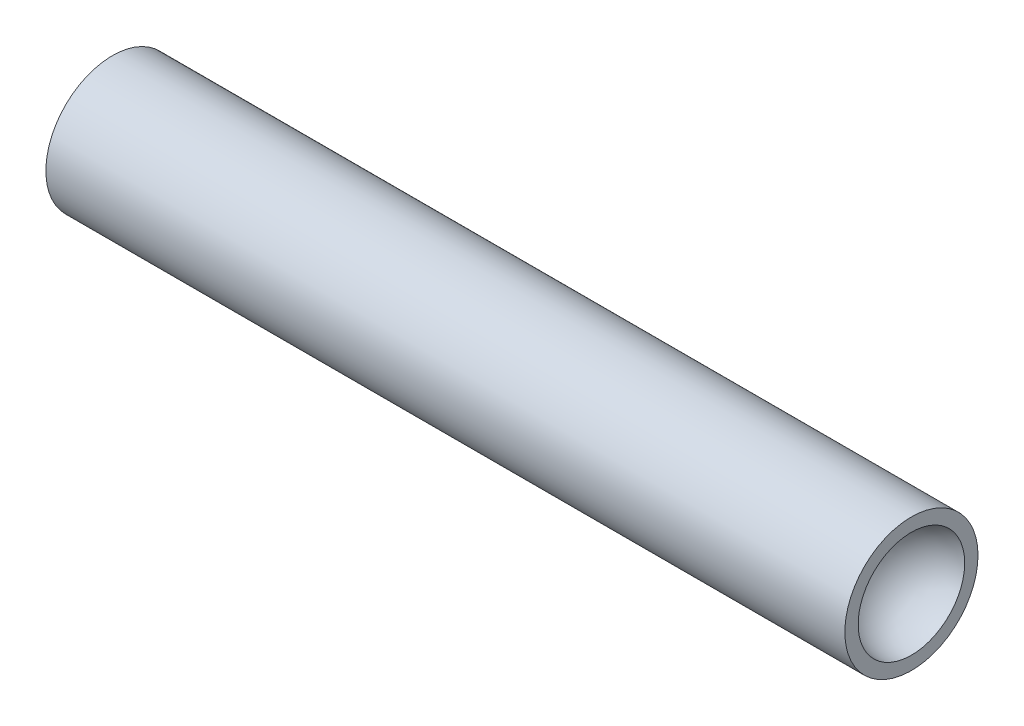
ISO-10303-21;
HEADER;
FILE_DESCRIPTION(('STEP AP214'),'2;1');
FILE_NAME('part.step','',(''),(''),'','','');
FILE_SCHEMA(('AUTOMOTIVE_DESIGN { 1 0 10303 214 1 1 1 1 }'));
ENDSEC;
DATA;
#1=APPLICATION_CONTEXT('core data for automotive mechanical design processes');
#2=APPLICATION_PROTOCOL_DEFINITION('international standard','automotive_design',2000,#1);
#3=PRODUCT_CONTEXT('',#1,'mechanical');
#4=PRODUCT('Part','Part','',(#3));
#5=PRODUCT_RELATED_PRODUCT_CATEGORY('part','',(#4));
#6=PRODUCT_DEFINITION_FORMATION('','',#4);
#7=PRODUCT_DEFINITION_CONTEXT('part definition',#1,'design');
#8=PRODUCT_DEFINITION('design','',#6,#7);
#9=PRODUCT_DEFINITION_SHAPE('','',#8);
#10=(LENGTH_UNIT() NAMED_UNIT(*) SI_UNIT(.MILLI.,.METRE.));
#11=(NAMED_UNIT(*) PLANE_ANGLE_UNIT() SI_UNIT($,.RADIAN.));
#12=(NAMED_UNIT(*) SI_UNIT($,.STERADIAN.) SOLID_ANGLE_UNIT());
#13=UNCERTAINTY_MEASURE_WITH_UNIT(LENGTH_MEASURE(1.E-05),#10,'distance_accuracy_value','');
#14=(GEOMETRIC_REPRESENTATION_CONTEXT(3) GLOBAL_UNCERTAINTY_ASSIGNED_CONTEXT((#13)) GLOBAL_UNIT_ASSIGNED_CONTEXT((#10,
#11,#12)) REPRESENTATION_CONTEXT('',''));
#15=CARTESIAN_POINT('',(0.,0.,0.));
#16=DIRECTION('',(0.,0.,1.));
#17=DIRECTION('',(1.,0.,0.));
#18=AXIS2_PLACEMENT_3D('',#15,#16,#17);
#19=CARTESIAN_POINT('',(300.,0.,0.));
#20=DIRECTION('',(-1.,0.,0.));
#21=DIRECTION('',(0.,0.,1.));
#22=AXIS2_PLACEMENT_3D('',#19,#20,#21);
#23=CYLINDRICAL_SURFACE('',#22,25.);
#24=CARTESIAN_POINT('',(300.,0.,0.));
#25=DIRECTION('',(1.,0.,0.));
#26=DIRECTION('',(0.,0.,-1.));
#27=AXIS2_PLACEMENT_3D('',#24,#25,#26);
#28=CIRCLE('',#27,25.);
#29=CARTESIAN_POINT('',(300.,0.,-25.));
#30=VERTEX_POINT('',#29);
#31=EDGE_CURVE('E10',#30,#30,#28,.T.);
#32=ORIENTED_EDGE('',*,*,#31,.F.);
#33=EDGE_LOOP('',(#32));
#34=FACE_BOUND('',#33,.T.);
#35=CARTESIAN_POINT('',(0.,0.,0.));
#36=DIRECTION('',(1.,0.,0.));
#37=DIRECTION('',(0.,0.,-1.));
#38=AXIS2_PLACEMENT_3D('',#35,#36,#37);
#39=CIRCLE('',#38,25.);
#40=CARTESIAN_POINT('',(0.,0.,-25.));
#41=VERTEX_POINT('',#40);
#42=EDGE_CURVE('E41',#41,#41,#39,.T.);
#43=ORIENTED_EDGE('',*,*,#42,.T.);
#44=EDGE_LOOP('',(#43));
#45=FACE_BOUND('',#44,.T.);
#46=ADVANCED_FACE('F34',(#34,#45),#23,.T.);
#47=CARTESIAN_POINT('',(300.,0.,0.));
#48=DIRECTION('',(1.,0.,0.));
#49=DIRECTION('',(0.,0.,-1.));
#50=AXIS2_PLACEMENT_3D('',#47,#48,#49);
#51=PLANE('',#50);
#52=CARTESIAN_POINT('',(300.,0.,0.));
#53=DIRECTION('',(1.,0.,0.));
#54=DIRECTION('',(0.,0.,-1.));
#55=AXIS2_PLACEMENT_3D('',#52,#53,#54);
#56=CIRCLE('',#55,20.);
#57=CARTESIAN_POINT('',(300.,0.,-20.));
#58=VERTEX_POINT('',#57);
#59=EDGE_CURVE('E37',#58,#58,#56,.T.);
#60=ORIENTED_EDGE('',*,*,#59,.F.);
#61=EDGE_LOOP('',(#60));
#62=FACE_BOUND('',#61,.T.);
#63=ORIENTED_EDGE('',*,*,#31,.T.);
#64=EDGE_LOOP('',(#63));
#65=FACE_BOUND('',#64,.T.);
#66=ADVANCED_FACE('F59',(#62,#65),#51,.T.);
#67=CARTESIAN_POINT('',(0.,0.,0.));
#68=DIRECTION('',(1.,0.,0.));
#69=DIRECTION('',(0.,0.,-1.));
#70=AXIS2_PLACEMENT_3D('',#67,#68,#69);
#71=PLANE('',#70);
#72=CARTESIAN_POINT('',(0.,0.,0.));
#73=DIRECTION('',(-1.,0.,0.));
#74=DIRECTION('',(0.,0.,1.));
#75=AXIS2_PLACEMENT_3D('',#72,#73,#74);
#76=CIRCLE('',#75,20.);
#77=CARTESIAN_POINT('',(0.,0.,20.));
#78=VERTEX_POINT('',#77);
#79=EDGE_CURVE('E47',#78,#78,#76,.T.);
#80=ORIENTED_EDGE('',*,*,#79,.F.);
#81=EDGE_LOOP('',(#80));
#82=FACE_BOUND('',#81,.T.);
#83=ORIENTED_EDGE('',*,*,#42,.F.);
#84=EDGE_LOOP('',(#83));
#85=FACE_BOUND('',#84,.T.);
#86=ADVANCED_FACE('F61',(#82,#85),#71,.F.);
#87=CARTESIAN_POINT('',(300.,0.,0.));
#88=DIRECTION('',(0.,0.,-1.));
#89=DIRECTION('',(0.,-1.,0.));
#90=AXIS2_PLACEMENT_3D('',#87,#88,#89);
#91=SPHERICAL_SURFACE('',#90,20.);
#92=CARTESIAN_POINT('',(300.,0.,0.));
#93=DIRECTION('',(1.,0.,0.));
#94=DIRECTION('',(0.,0.,-1.));
#95=AXIS2_PLACEMENT_3D('',#92,#93,#94);
#96=SPHERICAL_SURFACE('',#95,20.);
#97=ORIENTED_EDGE('',*,*,#59,.T.);
#98=EDGE_LOOP('',(#97));
#99=FACE_BOUND('',#98,.T.);
#100=ADVANCED_FACE('F57',(#99),#96,.F.);
#101=CARTESIAN_POINT('',(200.,0.,0.));
#102=DIRECTION('',(-1.,0.,0.));
#103=DIRECTION('',(0.,0.,1.));
#104=AXIS2_PLACEMENT_3D('',#101,#102,#103);
#105=CYLINDRICAL_SURFACE('',#104,20.);
#106=CARTESIAN_POINT('',(200.,0.,0.));
#107=DIRECTION('',(-1.,0.,0.));
#108=DIRECTION('',(0.,0.,1.));
#109=AXIS2_PLACEMENT_3D('',#106,#107,#108);
#110=CIRCLE('',#109,20.);
#111=CARTESIAN_POINT('',(200.,0.,20.));
#112=VERTEX_POINT('',#111);
#113=EDGE_CURVE('E50',#112,#112,#110,.T.);
#114=ORIENTED_EDGE('',*,*,#113,.F.);
#115=EDGE_LOOP('',(#114));
#116=FACE_BOUND('',#115,.T.);
#117=ORIENTED_EDGE('',*,*,#79,.T.);
#118=EDGE_LOOP('',(#117));
#119=FACE_BOUND('',#118,.T.);
#120=ADVANCED_FACE('F72',(#116,#119),#105,.F.);
#121=CARTESIAN_POINT('',(200.,0.,0.));
#122=DIRECTION('',(-1.,0.,0.));
#123=DIRECTION('',(0.,0.,1.));
#124=AXIS2_PLACEMENT_3D('',#121,#122,#123);
#125=PLANE('',#124);
#126=ORIENTED_EDGE('',*,*,#113,.T.);
#127=EDGE_LOOP('',(#126));
#128=FACE_BOUND('',#127,.T.);
#129=ADVANCED_FACE('F75',(#128),#125,.T.);
#130=CLOSED_SHELL('',(#46,#66,#86,#100,#120,#129));
#131=MANIFOLD_SOLID_BREP('B2',#130);
#132=ADVANCED_BREP_SHAPE_REPRESENTATION('',(#18,#131),#14);
#133=SHAPE_DEFINITION_REPRESENTATION(#9,#132);
ENDSEC;
END-ISO-10303-21;
